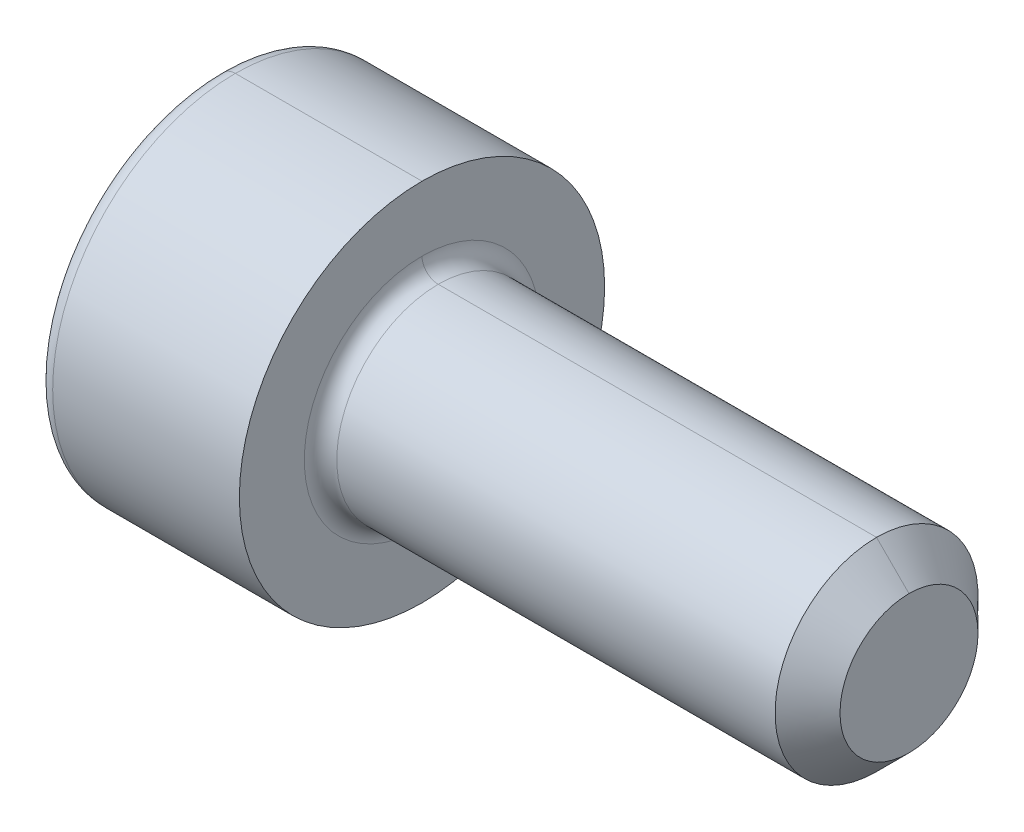
ISO-10303-21;
HEADER;
FILE_DESCRIPTION(('STEP AP214'),'2;1');
FILE_NAME('part.step','',(''),(''),'','','');
FILE_SCHEMA(('AUTOMOTIVE_DESIGN { 1 0 10303 214 1 1 1 1 }'));
ENDSEC;
DATA;
#1=APPLICATION_CONTEXT('core data for automotive mechanical design processes');
#2=APPLICATION_PROTOCOL_DEFINITION('international standard','automotive_design',2000,#1);
#3=PRODUCT_CONTEXT('',#1,'mechanical');
#4=PRODUCT('Part','Part','',(#3));
#5=PRODUCT_RELATED_PRODUCT_CATEGORY('part','',(#4));
#6=PRODUCT_DEFINITION_FORMATION('','',#4);
#7=PRODUCT_DEFINITION_CONTEXT('part definition',#1,'design');
#8=PRODUCT_DEFINITION('design','',#6,#7);
#9=PRODUCT_DEFINITION_SHAPE('','',#8);
#10=(LENGTH_UNIT() NAMED_UNIT(*) SI_UNIT(.MILLI.,.METRE.));
#11=(NAMED_UNIT(*) PLANE_ANGLE_UNIT() SI_UNIT($,.RADIAN.));
#12=(NAMED_UNIT(*) SI_UNIT($,.STERADIAN.) SOLID_ANGLE_UNIT());
#13=UNCERTAINTY_MEASURE_WITH_UNIT(LENGTH_MEASURE(1.E-05),#10,'distance_accuracy_value','');
#14=(GEOMETRIC_REPRESENTATION_CONTEXT(3) GLOBAL_UNCERTAINTY_ASSIGNED_CONTEXT((#13)) GLOBAL_UNIT_ASSIGNED_CONTEXT((#10,
#11,#12)) REPRESENTATION_CONTEXT('',''));
#15=CARTESIAN_POINT('',(0.,0.,0.));
#16=DIRECTION('',(0.,0.,1.));
#17=DIRECTION('',(1.,0.,0.));
#18=AXIS2_PLACEMENT_3D('',#15,#16,#17);
#19=CARTESIAN_POINT('',(1.5,0.,0.));
#20=DIRECTION('',(-1.,0.,0.));
#21=DIRECTION('',(0.,1.,0.));
#22=AXIS2_PLACEMENT_3D('',#19,#20,#21);
#23=PLANE('',#22);
#24=DIRECTION('',(0.,-0.866025403784439,0.5));
#25=VECTOR('',#24,1.);
#26=CARTESIAN_POINT('',(1.5,0.,-1.15470053837925));
#27=LINE('',#26,#25);
#28=CARTESIAN_POINT('',(1.5,0.,-1.15470053837925));
#29=VERTEX_POINT('',#28);
#30=CARTESIAN_POINT('',(1.5,-1.,-0.577350269189625));
#31=VERTEX_POINT('',#30);
#32=EDGE_CURVE('E276',#29,#31,#27,.T.);
#33=ORIENTED_EDGE('',*,*,#32,.T.);
#34=DIRECTION('',(0.,0.,1.));
#35=VECTOR('',#34,1.);
#36=CARTESIAN_POINT('',(1.5,-1.,-0.577350269189625));
#37=LINE('',#36,#35);
#38=CARTESIAN_POINT('',(1.5,-1.,0.577350269189626));
#39=VERTEX_POINT('',#38);
#40=EDGE_CURVE('E11',#31,#39,#37,.T.);
#41=ORIENTED_EDGE('',*,*,#40,.T.);
#42=DIRECTION('',(0.,0.866025403784439,0.5));
#43=VECTOR('',#42,1.);
#44=CARTESIAN_POINT('',(1.5,-1.,0.577350269189626));
#45=LINE('',#44,#43);
#46=CARTESIAN_POINT('',(1.5,0.,1.15470053837925));
#47=VERTEX_POINT('',#46);
#48=EDGE_CURVE('E46',#39,#47,#45,.T.);
#49=ORIENTED_EDGE('',*,*,#48,.T.);
#50=DIRECTION('',(0.,0.866025403784439,-0.5));
#51=VECTOR('',#50,1.);
#52=CARTESIAN_POINT('',(1.5,0.,1.15470053837925));
#53=LINE('',#52,#51);
#54=CARTESIAN_POINT('',(1.5,1.,0.577350269189626));
#55=VERTEX_POINT('',#54);
#56=EDGE_CURVE('E230',#47,#55,#53,.T.);
#57=ORIENTED_EDGE('',*,*,#56,.T.);
#58=DIRECTION('',(0.,0.,-1.));
#59=VECTOR('',#58,1.);
#60=CARTESIAN_POINT('',(1.5,1.,0.577350269189626));
#61=LINE('',#60,#59);
#62=CARTESIAN_POINT('',(1.5,1.,-0.577350269189625));
#63=VERTEX_POINT('',#62);
#64=EDGE_CURVE('E288',#55,#63,#61,.T.);
#65=ORIENTED_EDGE('',*,*,#64,.T.);
#66=DIRECTION('',(0.,-0.866025403784439,-0.5));
#67=VECTOR('',#66,1.);
#68=CARTESIAN_POINT('',(1.5,1.,-0.577350269189625));
#69=LINE('',#68,#67);
#70=EDGE_CURVE('E282',#63,#29,#69,.T.);
#71=ORIENTED_EDGE('',*,*,#70,.T.);
#72=EDGE_LOOP('',(#33,#41,#49,#57,#65,#71));
#73=FACE_BOUND('',#72,.T.);
#74=ADVANCED_FACE('F17',(#73),#23,.T.);
#75=CARTESIAN_POINT('',(1.5,-1.,-0.577350269189625));
#76=DIRECTION('',(0.,-1.,0.));
#77=DIRECTION('',(-1.,0.,0.));
#78=AXIS2_PLACEMENT_3D('',#75,#76,#77);
#79=PLANE('',#78);
#80=DIRECTION('',(0.,0.,1.));
#81=VECTOR('',#80,1.);
#82=CARTESIAN_POINT('',(0.,-1.,-0.577350269189625));
#83=LINE('',#82,#81);
#84=CARTESIAN_POINT('',(0.,-1.,-0.577350269189625));
#85=VERTEX_POINT('',#84);
#86=CARTESIAN_POINT('',(0.,-1.,0.577350269189626));
#87=VERTEX_POINT('',#86);
#88=EDGE_CURVE('E205',#85,#87,#83,.T.);
#89=ORIENTED_EDGE('',*,*,#88,.T.);
#90=DIRECTION('',(-1.,0.,0.));
#91=VECTOR('',#90,1.);
#92=CARTESIAN_POINT('',(1.5,-1.,0.577350269189626));
#93=LINE('',#92,#91);
#94=EDGE_CURVE('E21',#39,#87,#93,.T.);
#95=ORIENTED_EDGE('',*,*,#94,.F.);
#96=ORIENTED_EDGE('',*,*,#40,.F.);
#97=DIRECTION('',(-1.,0.,0.));
#98=VECTOR('',#97,1.);
#99=CARTESIAN_POINT('',(1.5,-1.,-0.577350269189625));
#100=LINE('',#99,#98);
#101=EDGE_CURVE('E213',#31,#85,#100,.T.);
#102=ORIENTED_EDGE('',*,*,#101,.T.);
#103=EDGE_LOOP('',(#89,#95,#96,#102));
#104=FACE_BOUND('',#103,.T.);
#105=ADVANCED_FACE('F19',(#104),#79,.F.);
#106=CARTESIAN_POINT('',(1.5,-1.,0.577350269189626));
#107=DIRECTION('',(0.,-0.5,0.866025403784439));
#108=DIRECTION('',(-1.,0.,0.));
#109=AXIS2_PLACEMENT_3D('',#106,#107,#108);
#110=PLANE('',#109);
#111=DIRECTION('',(0.,0.866025403784439,0.5));
#112=VECTOR('',#111,1.);
#113=CARTESIAN_POINT('',(0.,-1.,0.577350269189626));
#114=LINE('',#113,#112);
#115=CARTESIAN_POINT('',(0.,0.,1.15470053837925));
#116=VERTEX_POINT('',#115);
#117=EDGE_CURVE('E201',#87,#116,#114,.T.);
#118=ORIENTED_EDGE('',*,*,#117,.T.);
#119=DIRECTION('',(-1.,0.,0.));
#120=VECTOR('',#119,1.);
#121=CARTESIAN_POINT('',(1.5,0.,1.15470053837925));
#122=LINE('',#121,#120);
#123=EDGE_CURVE('E233',#47,#116,#122,.T.);
#124=ORIENTED_EDGE('',*,*,#123,.F.);
#125=ORIENTED_EDGE('',*,*,#48,.F.);
#126=ORIENTED_EDGE('',*,*,#94,.T.);
#127=EDGE_LOOP('',(#118,#124,#125,#126));
#128=FACE_BOUND('',#127,.T.);
#129=ADVANCED_FACE('F300',(#128),#110,.F.);
#130=CARTESIAN_POINT('',(1.5,0.,1.15470053837925));
#131=DIRECTION('',(0.,0.5,0.866025403784439));
#132=DIRECTION('',(1.,0.,0.));
#133=AXIS2_PLACEMENT_3D('',#130,#131,#132);
#134=PLANE('',#133);
#135=DIRECTION('',(0.,0.866025403784439,-0.5));
#136=VECTOR('',#135,1.);
#137=CARTESIAN_POINT('',(0.,0.,1.15470053837925));
#138=LINE('',#137,#136);
#139=CARTESIAN_POINT('',(0.,1.,0.577350269189626));
#140=VERTEX_POINT('',#139);
#141=EDGE_CURVE('E206',#116,#140,#138,.T.);
#142=ORIENTED_EDGE('',*,*,#141,.T.);
#143=DIRECTION('',(-1.,0.,0.));
#144=VECTOR('',#143,1.);
#145=CARTESIAN_POINT('',(1.5,1.,0.577350269189626));
#146=LINE('',#145,#144);
#147=EDGE_CURVE('E234',#55,#140,#146,.T.);
#148=ORIENTED_EDGE('',*,*,#147,.F.);
#149=ORIENTED_EDGE('',*,*,#56,.F.);
#150=ORIENTED_EDGE('',*,*,#123,.T.);
#151=EDGE_LOOP('',(#142,#148,#149,#150));
#152=FACE_BOUND('',#151,.T.);
#153=ADVANCED_FACE('F312',(#152),#134,.F.);
#154=CARTESIAN_POINT('',(1.5,1.,0.577350269189626));
#155=DIRECTION('',(0.,1.,0.));
#156=DIRECTION('',(1.,0.,0.));
#157=AXIS2_PLACEMENT_3D('',#154,#155,#156);
#158=PLANE('',#157);
#159=DIRECTION('',(0.,0.,-1.));
#160=VECTOR('',#159,1.);
#161=CARTESIAN_POINT('',(0.,1.,0.577350269189626));
#162=LINE('',#161,#160);
#163=CARTESIAN_POINT('',(0.,1.,-0.577350269189625));
#164=VERTEX_POINT('',#163);
#165=EDGE_CURVE('E258',#140,#164,#162,.T.);
#166=ORIENTED_EDGE('',*,*,#165,.T.);
#167=DIRECTION('',(-1.,0.,0.));
#168=VECTOR('',#167,1.);
#169=CARTESIAN_POINT('',(1.5,1.,-0.577350269189625));
#170=LINE('',#169,#168);
#171=EDGE_CURVE('E285',#63,#164,#170,.T.);
#172=ORIENTED_EDGE('',*,*,#171,.F.);
#173=ORIENTED_EDGE('',*,*,#64,.F.);
#174=ORIENTED_EDGE('',*,*,#147,.T.);
#175=EDGE_LOOP('',(#166,#172,#173,#174));
#176=FACE_BOUND('',#175,.T.);
#177=ADVANCED_FACE('F319',(#176),#158,.F.);
#178=CARTESIAN_POINT('',(1.5,1.,-0.577350269189625));
#179=DIRECTION('',(0.,0.5,-0.866025403784439));
#180=DIRECTION('',(-1.,0.,0.));
#181=AXIS2_PLACEMENT_3D('',#178,#179,#180);
#182=PLANE('',#181);
#183=DIRECTION('',(0.,-0.866025403784439,-0.5));
#184=VECTOR('',#183,1.);
#185=CARTESIAN_POINT('',(0.,1.,-0.577350269189625));
#186=LINE('',#185,#184);
#187=CARTESIAN_POINT('',(0.,0.,-1.15470053837925));
#188=VERTEX_POINT('',#187);
#189=EDGE_CURVE('E254',#164,#188,#186,.T.);
#190=ORIENTED_EDGE('',*,*,#189,.T.);
#191=DIRECTION('',(-1.,0.,0.));
#192=VECTOR('',#191,1.);
#193=CARTESIAN_POINT('',(1.5,0.,-1.15470053837925));
#194=LINE('',#193,#192);
#195=EDGE_CURVE('E279',#29,#188,#194,.T.);
#196=ORIENTED_EDGE('',*,*,#195,.F.);
#197=ORIENTED_EDGE('',*,*,#70,.F.);
#198=ORIENTED_EDGE('',*,*,#171,.T.);
#199=EDGE_LOOP('',(#190,#196,#197,#198));
#200=FACE_BOUND('',#199,.T.);
#201=ADVANCED_FACE('F321',(#200),#182,.F.);
#202=CARTESIAN_POINT('',(1.5,0.,-1.15470053837925));
#203=DIRECTION('',(0.,-0.5,-0.866025403784439));
#204=DIRECTION('',(0.,-0.866025403784439,0.5));
#205=AXIS2_PLACEMENT_3D('',#202,#203,#204);
#206=PLANE('',#205);
#207=DIRECTION('',(0.,-0.866025403784439,0.5));
#208=VECTOR('',#207,1.);
#209=CARTESIAN_POINT('',(0.,0.,-1.15470053837925));
#210=LINE('',#209,#208);
#211=EDGE_CURVE('E157',#188,#85,#210,.T.);
#212=ORIENTED_EDGE('',*,*,#211,.T.);
#213=ORIENTED_EDGE('',*,*,#101,.F.);
#214=ORIENTED_EDGE('',*,*,#32,.F.);
#215=ORIENTED_EDGE('',*,*,#195,.T.);
#216=EDGE_LOOP('',(#212,#213,#214,#215));
#217=FACE_BOUND('',#216,.T.);
#218=ADVANCED_FACE('F324',(#217),#206,.F.);
#219=CARTESIAN_POINT('',(8.5,0.85,0.));
#220=DIRECTION('',(1.,0.,0.));
#221=DIRECTION('',(0.,-1.,0.));
#222=AXIS2_PLACEMENT_3D('',#219,#220,#221);
#223=PLANE('',#222);
#224=CARTESIAN_POINT('',(8.5,0.,0.));
#225=DIRECTION('',(1.,0.,0.));
#226=DIRECTION('',(0.,1.,0.));
#227=AXIS2_PLACEMENT_3D('',#224,#225,#226);
#228=CIRCLE('',#227,0.85);
#229=CARTESIAN_POINT('',(8.5,-0.85,0.));
#230=VERTEX_POINT('',#229);
#231=CARTESIAN_POINT('',(8.5,0.85,0.));
#232=VERTEX_POINT('',#231);
#233=EDGE_CURVE('E210',#230,#232,#228,.T.);
#234=ORIENTED_EDGE('',*,*,#233,.T.);
#235=CARTESIAN_POINT('',(8.5,0.,0.));
#236=DIRECTION('',(1.,0.,0.));
#237=DIRECTION('',(0.,1.,0.));
#238=AXIS2_PLACEMENT_3D('',#235,#236,#237);
#239=CIRCLE('',#238,0.85);
#240=EDGE_CURVE('E396',#232,#230,#239,.T.);
#241=ORIENTED_EDGE('',*,*,#240,.T.);
#242=EDGE_LOOP('',(#234,#241));
#243=FACE_BOUND('',#242,.T.);
#244=ADVANCED_FACE('F326',(#243),#223,.T.);
#245=CARTESIAN_POINT('',(8.5,0.,0.));
#246=DIRECTION('',(-1.,0.,0.));
#247=DIRECTION('',(0.,-1.,0.));
#248=AXIS2_PLACEMENT_3D('',#245,#246,#247);
#249=CONICAL_SURFACE('',#248,0.85,0.785398163397449);
#250=DIRECTION('',(-0.707106781186547,0.707106781186549,0.));
#251=VECTOR('',#250,1.);
#252=CARTESIAN_POINT('',(8.5,0.85,0.));
#253=LINE('',#252,#251);
#254=CARTESIAN_POINT('',(8.1,1.25,0.));
#255=VERTEX_POINT('',#254);
#256=EDGE_CURVE('E183',#232,#255,#253,.T.);
#257=ORIENTED_EDGE('',*,*,#256,.F.);
#258=ORIENTED_EDGE('',*,*,#233,.F.);
#259=DIRECTION('',(-0.707106781186547,-0.707106781186549,0.));
#260=VECTOR('',#259,1.);
#261=CARTESIAN_POINT('',(8.5,-0.85,0.));
#262=LINE('',#261,#260);
#263=CARTESIAN_POINT('',(8.1,-1.25,0.));
#264=VERTEX_POINT('',#263);
#265=EDGE_CURVE('E188',#230,#264,#262,.T.);
#266=ORIENTED_EDGE('',*,*,#265,.T.);
#267=CARTESIAN_POINT('',(8.1,0.,0.));
#268=DIRECTION('',(1.,0.,0.));
#269=DIRECTION('',(0.,1.,0.));
#270=AXIS2_PLACEMENT_3D('',#267,#268,#269);
#271=CIRCLE('',#270,1.25);
#272=EDGE_CURVE('E214',#264,#255,#271,.T.);
#273=ORIENTED_EDGE('',*,*,#272,.T.);
#274=EDGE_LOOP('',(#257,#258,#266,#273));
#275=FACE_BOUND('',#274,.T.);
#276=ADVANCED_FACE('F333',(#275),#249,.T.);
#277=CARTESIAN_POINT('',(8.5,0.,0.));
#278=DIRECTION('',(1.,0.,0.));
#279=DIRECTION('',(0.,1.,0.));
#280=AXIS2_PLACEMENT_3D('',#277,#278,#279);
#281=CYLINDRICAL_SURFACE('',#280,1.25);
#282=DIRECTION('',(1.,0.,0.));
#283=VECTOR('',#282,1.);
#284=CARTESIAN_POINT('',(8.5,-1.25,0.));
#285=LINE('',#284,#283);
#286=CARTESIAN_POINT('',(2.7,-1.25,0.));
#287=VERTEX_POINT('',#286);
#288=EDGE_CURVE('E187',#287,#264,#285,.T.);
#289=ORIENTED_EDGE('',*,*,#288,.F.);
#290=CARTESIAN_POINT('',(2.7,0.,0.));
#291=DIRECTION('',(1.,0.,0.));
#292=DIRECTION('',(0.,1.,0.));
#293=AXIS2_PLACEMENT_3D('',#290,#291,#292);
#294=CIRCLE('',#293,1.25);
#295=CARTESIAN_POINT('',(2.7,1.25,0.));
#296=VERTEX_POINT('',#295);
#297=EDGE_CURVE('E222',#287,#296,#294,.T.);
#298=ORIENTED_EDGE('',*,*,#297,.T.);
#299=DIRECTION('',(1.,0.,0.));
#300=VECTOR('',#299,1.);
#301=CARTESIAN_POINT('',(8.5,1.25,0.));
#302=LINE('',#301,#300);
#303=EDGE_CURVE('E218',#296,#255,#302,.T.);
#304=ORIENTED_EDGE('',*,*,#303,.T.);
#305=ORIENTED_EDGE('',*,*,#272,.F.);
#306=EDGE_LOOP('',(#289,#298,#304,#305));
#307=FACE_BOUND('',#306,.T.);
#308=ADVANCED_FACE('F362',(#307),#281,.T.);
#309=CARTESIAN_POINT('',(2.7,0.,0.));
#310=DIRECTION('',(1.,0.,0.));
#311=DIRECTION('',(0.,1.,0.));
#312=AXIS2_PLACEMENT_3D('',#309,#310,#311);
#313=TOROIDAL_SURFACE('',#312,1.45,0.2);
#314=CARTESIAN_POINT('',(2.7,-1.45,0.));
#315=DIRECTION('',(0.,0.,1.));
#316=DIRECTION('',(0.,-1.,0.));
#317=AXIS2_PLACEMENT_3D('',#314,#315,#316);
#318=CIRCLE('',#317,0.2);
#319=CARTESIAN_POINT('',(2.5,-1.45,0.));
#320=VERTEX_POINT('',#319);
#321=EDGE_CURVE('E226',#287,#320,#318,.T.);
#322=ORIENTED_EDGE('',*,*,#321,.F.);
#323=CARTESIAN_POINT('',(2.7,0.,0.));
#324=DIRECTION('',(1.,0.,0.));
#325=DIRECTION('',(0.,1.,0.));
#326=AXIS2_PLACEMENT_3D('',#323,#324,#325);
#327=CIRCLE('',#326,1.25);
#328=EDGE_CURVE('E184',#296,#287,#327,.T.);
#329=ORIENTED_EDGE('',*,*,#328,.F.);
#330=CARTESIAN_POINT('',(2.7,1.45,0.));
#331=DIRECTION('',(0.,0.,-1.));
#332=DIRECTION('',(-1.,0.,0.));
#333=AXIS2_PLACEMENT_3D('',#330,#331,#332);
#334=CIRCLE('',#333,0.2);
#335=CARTESIAN_POINT('',(2.5,1.45,0.));
#336=VERTEX_POINT('',#335);
#337=EDGE_CURVE('E196',#296,#336,#334,.T.);
#338=ORIENTED_EDGE('',*,*,#337,.T.);
#339=CARTESIAN_POINT('',(2.5,0.,0.));
#340=DIRECTION('',(1.,0.,0.));
#341=DIRECTION('',(0.,1.,0.));
#342=AXIS2_PLACEMENT_3D('',#339,#340,#341);
#343=CIRCLE('',#342,1.45);
#344=EDGE_CURVE('E241',#336,#320,#343,.T.);
#345=ORIENTED_EDGE('',*,*,#344,.T.);
#346=EDGE_LOOP('',(#322,#329,#338,#345));
#347=FACE_BOUND('',#346,.T.);
#348=ADVANCED_FACE('F357',(#347),#313,.F.);
#349=CARTESIAN_POINT('',(2.5,2.25,0.));
#350=DIRECTION('',(1.,0.,0.));
#351=DIRECTION('',(0.,-1.,0.));
#352=AXIS2_PLACEMENT_3D('',#349,#350,#351);
#353=PLANE('',#352);
#354=ORIENTED_EDGE('',*,*,#344,.F.);
#355=CARTESIAN_POINT('',(2.5,0.,0.));
#356=DIRECTION('',(1.,0.,0.));
#357=DIRECTION('',(0.,1.,0.));
#358=AXIS2_PLACEMENT_3D('',#355,#356,#357);
#359=CIRCLE('',#358,1.45);
#360=EDGE_CURVE('E200',#320,#336,#359,.T.);
#361=ORIENTED_EDGE('',*,*,#360,.F.);
#362=EDGE_LOOP('',(#354,#361));
#363=FACE_BOUND('',#362,.T.);
#364=CARTESIAN_POINT('',(2.5,0.,0.));
#365=DIRECTION('',(1.,0.,0.));
#366=DIRECTION('',(0.,1.,0.));
#367=AXIS2_PLACEMENT_3D('',#364,#365,#366);
#368=CIRCLE('',#367,2.25);
#369=CARTESIAN_POINT('',(2.5,2.25,0.));
#370=VERTEX_POINT('',#369);
#371=CARTESIAN_POINT('',(2.5,-2.25,0.));
#372=VERTEX_POINT('',#371);
#373=EDGE_CURVE('E179',#370,#372,#368,.T.);
#374=ORIENTED_EDGE('',*,*,#373,.T.);
#375=CARTESIAN_POINT('',(2.5,0.,0.));
#376=DIRECTION('',(1.,0.,0.));
#377=DIRECTION('',(0.,1.,0.));
#378=AXIS2_PLACEMENT_3D('',#375,#376,#377);
#379=CIRCLE('',#378,2.25);
#380=EDGE_CURVE('E238',#372,#370,#379,.T.);
#381=ORIENTED_EDGE('',*,*,#380,.T.);
#382=EDGE_LOOP('',(#374,#381));
#383=FACE_BOUND('',#382,.T.);
#384=ADVANCED_FACE('F353',(#363,#383),#353,.T.);
#385=CARTESIAN_POINT('',(8.5,0.,0.));
#386=DIRECTION('',(1.,0.,0.));
#387=DIRECTION('',(0.,1.,0.));
#388=AXIS2_PLACEMENT_3D('',#385,#386,#387);
#389=CYLINDRICAL_SURFACE('',#388,2.25);
#390=DIRECTION('',(1.,0.,0.));
#391=VECTOR('',#390,1.);
#392=CARTESIAN_POINT('',(8.5,-2.25,0.));
#393=LINE('',#392,#391);
#394=CARTESIAN_POINT('',(0.2,-2.25,0.));
#395=VERTEX_POINT('',#394);
#396=EDGE_CURVE('E195',#395,#372,#393,.T.);
#397=ORIENTED_EDGE('',*,*,#396,.F.);
#398=CARTESIAN_POINT('',(0.2,0.,0.));
#399=DIRECTION('',(1.,0.,0.));
#400=DIRECTION('',(0.,1.,0.));
#401=AXIS2_PLACEMENT_3D('',#398,#399,#400);
#402=CIRCLE('',#401,2.25);
#403=CARTESIAN_POINT('',(0.2,2.25,0.));
#404=VERTEX_POINT('',#403);
#405=EDGE_CURVE('E242',#395,#404,#402,.T.);
#406=ORIENTED_EDGE('',*,*,#405,.T.);
#407=DIRECTION('',(1.,0.,0.));
#408=VECTOR('',#407,1.);
#409=CARTESIAN_POINT('',(8.5,2.25,0.));
#410=LINE('',#409,#408);
#411=EDGE_CURVE('E169',#404,#370,#410,.T.);
#412=ORIENTED_EDGE('',*,*,#411,.T.);
#413=ORIENTED_EDGE('',*,*,#380,.F.);
#414=EDGE_LOOP('',(#397,#406,#412,#413));
#415=FACE_BOUND('',#414,.T.);
#416=ADVANCED_FACE('F350',(#415),#389,.T.);
#417=CARTESIAN_POINT('',(0.2,0.,0.));
#418=DIRECTION('',(1.,0.,0.));
#419=DIRECTION('',(0.,1.,0.));
#420=AXIS2_PLACEMENT_3D('',#417,#418,#419);
#421=TOROIDAL_SURFACE('',#420,2.05,0.2);
#422=CARTESIAN_POINT('',(0.2,-2.05,0.));
#423=DIRECTION('',(0.,0.,1.));
#424=DIRECTION('',(0.,-1.,0.));
#425=AXIS2_PLACEMENT_3D('',#422,#423,#424);
#426=CIRCLE('',#425,0.2);
#427=CARTESIAN_POINT('',(0.,-2.05,0.));
#428=VERTEX_POINT('',#427);
#429=EDGE_CURVE('E152',#428,#395,#426,.T.);
#430=ORIENTED_EDGE('',*,*,#429,.F.);
#431=CARTESIAN_POINT('',(0.,0.,0.));
#432=DIRECTION('',(1.,0.,0.));
#433=DIRECTION('',(0.,1.,0.));
#434=AXIS2_PLACEMENT_3D('',#431,#432,#433);
#435=CIRCLE('',#434,2.05);
#436=CARTESIAN_POINT('',(0.,2.05,0.));
#437=VERTEX_POINT('',#436);
#438=EDGE_CURVE('E146',#428,#437,#435,.T.);
#439=ORIENTED_EDGE('',*,*,#438,.T.);
#440=CARTESIAN_POINT('',(0.2,2.05,0.));
#441=DIRECTION('',(0.,0.,-1.));
#442=DIRECTION('',(-1.,0.,0.));
#443=AXIS2_PLACEMENT_3D('',#440,#441,#442);
#444=CIRCLE('',#443,0.2);
#445=EDGE_CURVE('E149',#437,#404,#444,.T.);
#446=ORIENTED_EDGE('',*,*,#445,.T.);
#447=ORIENTED_EDGE('',*,*,#405,.F.);
#448=EDGE_LOOP('',(#430,#439,#446,#447));
#449=FACE_BOUND('',#448,.T.);
#450=ADVANCED_FACE('F148',(#449),#421,.T.);
#451=CARTESIAN_POINT('',(0.,0.,0.));
#452=DIRECTION('',(-1.,0.,0.));
#453=DIRECTION('',(0.,0.,1.));
#454=AXIS2_PLACEMENT_3D('',#451,#452,#453);
#455=PLANE('',#454);
#456=ORIENTED_EDGE('',*,*,#211,.F.);
#457=ORIENTED_EDGE('',*,*,#189,.F.);
#458=ORIENTED_EDGE('',*,*,#165,.F.);
#459=ORIENTED_EDGE('',*,*,#141,.F.);
#460=ORIENTED_EDGE('',*,*,#117,.F.);
#461=ORIENTED_EDGE('',*,*,#88,.F.);
#462=EDGE_LOOP('',(#456,#457,#458,#459,#460,#461));
#463=FACE_BOUND('',#462,.T.);
#464=CARTESIAN_POINT('',(0.,0.,0.));
#465=DIRECTION('',(1.,0.,0.));
#466=DIRECTION('',(0.,1.,0.));
#467=AXIS2_PLACEMENT_3D('',#464,#465,#466);
#468=CIRCLE('',#467,2.05);
#469=EDGE_CURVE('E162',#437,#428,#468,.T.);
#470=ORIENTED_EDGE('',*,*,#469,.F.);
#471=ORIENTED_EDGE('',*,*,#438,.F.);
#472=EDGE_LOOP('',(#470,#471));
#473=FACE_BOUND('',#472,.T.);
#474=ADVANCED_FACE('F167',(#463,#473),#455,.T.);
#475=CARTESIAN_POINT('',(0.2,0.,0.));
#476=DIRECTION('',(1.,0.,0.));
#477=DIRECTION('',(0.,1.,0.));
#478=AXIS2_PLACEMENT_3D('',#475,#476,#477);
#479=TOROIDAL_SURFACE('',#478,2.05,0.2);
#480=ORIENTED_EDGE('',*,*,#469,.T.);
#481=ORIENTED_EDGE('',*,*,#429,.T.);
#482=CARTESIAN_POINT('',(0.2,0.,0.));
#483=DIRECTION('',(1.,0.,0.));
#484=DIRECTION('',(0.,1.,0.));
#485=AXIS2_PLACEMENT_3D('',#482,#483,#484);
#486=CIRCLE('',#485,2.25);
#487=EDGE_CURVE('E164',#404,#395,#486,.T.);
#488=ORIENTED_EDGE('',*,*,#487,.F.);
#489=ORIENTED_EDGE('',*,*,#445,.F.);
#490=EDGE_LOOP('',(#480,#481,#488,#489));
#491=FACE_BOUND('',#490,.T.);
#492=ADVANCED_FACE('F161',(#491),#479,.T.);
#493=CARTESIAN_POINT('',(8.5,0.,0.));
#494=DIRECTION('',(1.,0.,0.));
#495=DIRECTION('',(0.,1.,0.));
#496=AXIS2_PLACEMENT_3D('',#493,#494,#495);
#497=CYLINDRICAL_SURFACE('',#496,2.25);
#498=ORIENTED_EDGE('',*,*,#487,.T.);
#499=ORIENTED_EDGE('',*,*,#396,.T.);
#500=ORIENTED_EDGE('',*,*,#373,.F.);
#501=ORIENTED_EDGE('',*,*,#411,.F.);
#502=EDGE_LOOP('',(#498,#499,#500,#501));
#503=FACE_BOUND('',#502,.T.);
#504=ADVANCED_FACE('F346',(#503),#497,.T.);
#505=CARTESIAN_POINT('',(2.7,0.,0.));
#506=DIRECTION('',(1.,0.,0.));
#507=DIRECTION('',(0.,1.,0.));
#508=AXIS2_PLACEMENT_3D('',#505,#506,#507);
#509=TOROIDAL_SURFACE('',#508,1.45,0.2);
#510=ORIENTED_EDGE('',*,*,#297,.F.);
#511=ORIENTED_EDGE('',*,*,#321,.T.);
#512=ORIENTED_EDGE('',*,*,#360,.T.);
#513=ORIENTED_EDGE('',*,*,#337,.F.);
#514=EDGE_LOOP('',(#510,#511,#512,#513));
#515=FACE_BOUND('',#514,.T.);
#516=ADVANCED_FACE('F370',(#515),#509,.F.);
#517=CARTESIAN_POINT('',(8.5,0.,0.));
#518=DIRECTION('',(1.,0.,0.));
#519=DIRECTION('',(0.,1.,0.));
#520=AXIS2_PLACEMENT_3D('',#517,#518,#519);
#521=CYLINDRICAL_SURFACE('',#520,1.25);
#522=ORIENTED_EDGE('',*,*,#328,.T.);
#523=ORIENTED_EDGE('',*,*,#288,.T.);
#524=CARTESIAN_POINT('',(8.1,0.,0.));
#525=DIRECTION('',(1.,0.,0.));
#526=DIRECTION('',(0.,1.,0.));
#527=AXIS2_PLACEMENT_3D('',#524,#525,#526);
#528=CIRCLE('',#527,1.25);
#529=EDGE_CURVE('E189',#255,#264,#528,.T.);
#530=ORIENTED_EDGE('',*,*,#529,.F.);
#531=ORIENTED_EDGE('',*,*,#303,.F.);
#532=EDGE_LOOP('',(#522,#523,#530,#531));
#533=FACE_BOUND('',#532,.T.);
#534=ADVANCED_FACE('F374',(#533),#521,.T.);
#535=CARTESIAN_POINT('',(8.5,0.,0.));
#536=DIRECTION('',(-1.,0.,0.));
#537=DIRECTION('',(0.,-1.,0.));
#538=AXIS2_PLACEMENT_3D('',#535,#536,#537);
#539=CONICAL_SURFACE('',#538,0.85,0.785398163397449);
#540=ORIENTED_EDGE('',*,*,#240,.F.);
#541=ORIENTED_EDGE('',*,*,#256,.T.);
#542=ORIENTED_EDGE('',*,*,#529,.T.);
#543=ORIENTED_EDGE('',*,*,#265,.F.);
#544=EDGE_LOOP('',(#540,#541,#542,#543));
#545=FACE_BOUND('',#544,.T.);
#546=ADVANCED_FACE('F379',(#545),#539,.T.);
#547=CLOSED_SHELL('',(#74,#105,#129,#153,#177,#201,#218,#244,#276,#308,#348,#384,#416,#450,#474,
#492,#504,#516,#534,#546));
#548=MANIFOLD_SOLID_BREP('B1',#547);
#549=ADVANCED_BREP_SHAPE_REPRESENTATION('',(#18,#548),#14);
#550=SHAPE_DEFINITION_REPRESENTATION(#9,#549);
ENDSEC;
END-ISO-10303-21;
